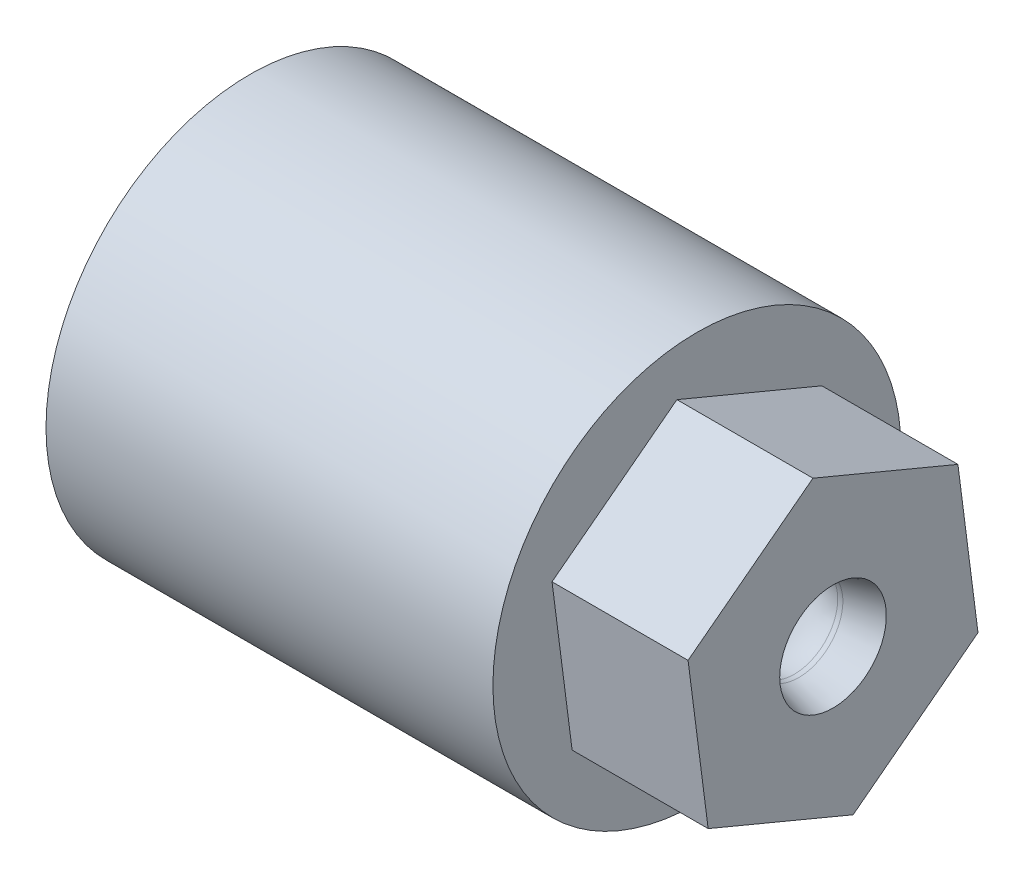
ISO-10303-21;
HEADER;
FILE_DESCRIPTION(('STEP AP214'),'2;1');
FILE_NAME('part.step','',(''),(''),'','','');
FILE_SCHEMA(('AUTOMOTIVE_DESIGN { 1 0 10303 214 1 1 1 1 }'));
ENDSEC;
DATA;
#1=APPLICATION_CONTEXT('core data for automotive mechanical design processes');
#2=APPLICATION_PROTOCOL_DEFINITION('international standard','automotive_design',2000,#1);
#3=PRODUCT_CONTEXT('',#1,'mechanical');
#4=PRODUCT('Part','Part','',(#3));
#5=PRODUCT_RELATED_PRODUCT_CATEGORY('part','',(#4));
#6=PRODUCT_DEFINITION_FORMATION('','',#4);
#7=PRODUCT_DEFINITION_CONTEXT('part definition',#1,'design');
#8=PRODUCT_DEFINITION('design','',#6,#7);
#9=PRODUCT_DEFINITION_SHAPE('','',#8);
#10=(LENGTH_UNIT() NAMED_UNIT(*) SI_UNIT(.MILLI.,.METRE.));
#11=(NAMED_UNIT(*) PLANE_ANGLE_UNIT() SI_UNIT($,.RADIAN.));
#12=(NAMED_UNIT(*) SI_UNIT($,.STERADIAN.) SOLID_ANGLE_UNIT());
#13=UNCERTAINTY_MEASURE_WITH_UNIT(LENGTH_MEASURE(1.E-05),#10,'distance_accuracy_value','');
#14=(GEOMETRIC_REPRESENTATION_CONTEXT(3) GLOBAL_UNCERTAINTY_ASSIGNED_CONTEXT((#13)) GLOBAL_UNIT_ASSIGNED_CONTEXT((#10,
#11,#12)) REPRESENTATION_CONTEXT('',''));
#15=CARTESIAN_POINT('',(0.,0.,0.));
#16=DIRECTION('',(0.,0.,1.));
#17=DIRECTION('',(1.,0.,0.));
#18=AXIS2_PLACEMENT_3D('',#15,#16,#17);
#19=CARTESIAN_POINT('',(1.81136600450768,9.525,0.));
#20=DIRECTION('',(-1.,0.,0.));
#21=DIRECTION('',(0.,0.,1.));
#22=AXIS2_PLACEMENT_3D('',#19,#20,#21);
#23=PLANE('',#22);
#24=CARTESIAN_POINT('',(1.81136600450768,0.,0.));
#25=DIRECTION('',(-1.,0.,0.));
#26=DIRECTION('',(0.,0.,1.));
#27=AXIS2_PLACEMENT_3D('',#24,#25,#26);
#28=CIRCLE('',#27,2.48868157866771);
#29=CARTESIAN_POINT('',(1.81136600450768,0.,2.48868157866771));
#30=VERTEX_POINT('',#29);
#31=EDGE_CURVE('E142',#30,#30,#28,.T.);
#32=ORIENTED_EDGE('',*,*,#31,.T.);
#33=EDGE_LOOP('',(#32));
#34=FACE_BOUND('',#33,.T.);
#35=DIRECTION('',(0.,-0.385175832029674,-0.922843203594331));
#36=VECTOR('',#35,1.);
#37=CARTESIAN_POINT('',(1.81136600450768,-5.860054342824,2.44586653338843));
#38=LINE('',#37,#36);
#39=CARTESIAN_POINT('',(1.81136600450768,-4.44793264137029,5.82917048568371));
#40=VERTEX_POINT('',#39);
#41=CARTESIAN_POINT('',(1.81136600450768,-7.27217604427771,-0.937437418906843));
#42=VERTEX_POINT('',#41);
#43=EDGE_CURVE('E49',#40,#42,#38,.T.);
#44=ORIENTED_EDGE('',*,*,#43,.T.);
#45=DIRECTION('',(0.,0.606617742007669,-0.794993657258671));
#46=VECTOR('',#45,1.);
#47=CARTESIAN_POINT('',(1.81136600450768,-5.04820972359256,-3.85202266174869));
#48=LINE('',#47,#46);
#49=CARTESIAN_POINT('',(1.81136600450768,-2.82424340290741,-6.76660790459055));
#50=VERTEX_POINT('',#49);
#51=EDGE_CURVE('E81',#42,#50,#48,.T.);
#52=ORIENTED_EDGE('',*,*,#51,.T.);
#53=DIRECTION('',(0.,0.991793574037343,0.12784954633566));
#54=VECTOR('',#53,1.);
#55=CARTESIAN_POINT('',(1.81136600450768,0.811844619231441,-6.29788919513713));
#56=LINE('',#55,#54);
#57=CARTESIAN_POINT('',(1.81136600450768,4.4479326413703,-5.8291704856837));
#58=VERTEX_POINT('',#57);
#59=EDGE_CURVE('E136',#50,#58,#56,.T.);
#60=ORIENTED_EDGE('',*,*,#59,.T.);
#61=DIRECTION('',(0.,0.385175832029674,0.922843203594331));
#62=VECTOR('',#61,1.);
#63=CARTESIAN_POINT('',(1.81136600450768,5.860054342824,-2.44586653338843));
#64=LINE('',#63,#62);
#65=CARTESIAN_POINT('',(1.81136600450768,7.27217604427771,0.937437418906843));
#66=VERTEX_POINT('',#65);
#67=EDGE_CURVE('E111',#58,#66,#64,.T.);
#68=ORIENTED_EDGE('',*,*,#67,.T.);
#69=DIRECTION('',(0.,-0.606617742007669,0.794993657258671));
#70=VECTOR('',#69,1.);
#71=CARTESIAN_POINT('',(1.81136600450768,5.04820972359256,3.85202266174869));
#72=LINE('',#71,#70);
#73=CARTESIAN_POINT('',(1.81136600450768,2.82424340290741,6.76660790459055));
#74=VERTEX_POINT('',#73);
#75=EDGE_CURVE('E132',#66,#74,#72,.T.);
#76=ORIENTED_EDGE('',*,*,#75,.T.);
#77=DIRECTION('',(0.,-0.991793574037343,-0.12784954633566));
#78=VECTOR('',#77,1.);
#79=CARTESIAN_POINT('',(1.81136600450768,-0.81184461923144,6.29788919513713));
#80=LINE('',#79,#78);
#81=EDGE_CURVE('E129',#74,#40,#80,.T.);
#82=ORIENTED_EDGE('',*,*,#81,.T.);
#83=EDGE_LOOP('',(#44,#52,#60,#68,#76,#82));
#84=FACE_BOUND('',#83,.T.);
#85=ADVANCED_FACE('F35',(#34,#84),#23,.F.);
#86=CARTESIAN_POINT('',(0.,0.,0.));
#87=DIRECTION('',(-1.,0.,0.));
#88=DIRECTION('',(0.,0.,1.));
#89=AXIS2_PLACEMENT_3D('',#86,#87,#88);
#90=CYLINDRICAL_SURFACE('',#89,9.525);
#91=CARTESIAN_POINT('',(-25.4,0.,0.));
#92=DIRECTION('',(-1.,0.,0.));
#93=DIRECTION('',(0.,0.,1.));
#94=AXIS2_PLACEMENT_3D('',#91,#92,#93);
#95=CIRCLE('',#94,9.525);
#96=CARTESIAN_POINT('',(-25.4,0.,9.525));
#97=VERTEX_POINT('',#96);
#98=EDGE_CURVE('E11',#97,#97,#95,.T.);
#99=ORIENTED_EDGE('',*,*,#98,.F.);
#100=EDGE_LOOP('',(#99));
#101=FACE_BOUND('',#100,.T.);
#102=CARTESIAN_POINT('',(-4.53863399549232,0.,0.));
#103=DIRECTION('',(1.,0.,0.));
#104=DIRECTION('',(0.,0.,-1.));
#105=AXIS2_PLACEMENT_3D('',#102,#103,#104);
#106=CIRCLE('',#105,9.525);
#107=CARTESIAN_POINT('',(-4.53863399549232,0.,-9.525));
#108=VERTEX_POINT('',#107);
#109=EDGE_CURVE('E124',#108,#108,#106,.T.);
#110=ORIENTED_EDGE('',*,*,#109,.F.);
#111=EDGE_LOOP('',(#110));
#112=FACE_BOUND('',#111,.T.);
#113=ADVANCED_FACE('F172',(#101,#112),#90,.T.);
#114=CARTESIAN_POINT('',(-25.4,5.74736391748426,0.));
#115=DIRECTION('',(1.,0.,0.));
#116=DIRECTION('',(0.,0.,-1.));
#117=AXIS2_PLACEMENT_3D('',#114,#115,#116);
#118=PLANE('',#117);
#119=CARTESIAN_POINT('',(-25.4,0.,0.));
#120=DIRECTION('',(-1.,0.,0.));
#121=DIRECTION('',(0.,0.,1.));
#122=AXIS2_PLACEMENT_3D('',#119,#120,#121);
#123=CIRCLE('',#122,5.74736391748426);
#124=CARTESIAN_POINT('',(-25.4,0.,5.74736391748426));
#125=VERTEX_POINT('',#124);
#126=EDGE_CURVE('E42',#125,#125,#123,.T.);
#127=ORIENTED_EDGE('',*,*,#126,.F.);
#128=EDGE_LOOP('',(#127));
#129=FACE_BOUND('',#128,.T.);
#130=ORIENTED_EDGE('',*,*,#98,.T.);
#131=EDGE_LOOP('',(#130));
#132=FACE_BOUND('',#131,.T.);
#133=ADVANCED_FACE('F169',(#129,#132),#118,.F.);
#134=CARTESIAN_POINT('',(0.,0.,0.));
#135=DIRECTION('',(-1.,0.,0.));
#136=DIRECTION('',(0.,0.,1.));
#137=AXIS2_PLACEMENT_3D('',#134,#135,#136);
#138=CYLINDRICAL_SURFACE('',#137,5.74736391748426);
#139=CARTESIAN_POINT('',(-6.29301491613203,0.,0.));
#140=DIRECTION('',(-1.,0.,0.));
#141=DIRECTION('',(0.,0.,1.));
#142=AXIS2_PLACEMENT_3D('',#139,#140,#141);
#143=CIRCLE('',#142,5.74736391748426);
#144=CARTESIAN_POINT('',(-6.29301491613203,0.,5.74736391748426));
#145=VERTEX_POINT('',#144);
#146=EDGE_CURVE('E162',#145,#145,#143,.T.);
#147=ORIENTED_EDGE('',*,*,#146,.F.);
#148=EDGE_LOOP('',(#147));
#149=FACE_BOUND('',#148,.T.);
#150=ORIENTED_EDGE('',*,*,#126,.T.);
#151=EDGE_LOOP('',(#150));
#152=FACE_BOUND('',#151,.T.);
#153=ADVANCED_FACE('F167',(#149,#152),#138,.F.);
#154=CARTESIAN_POINT('',(-6.29301491613202,0.,0.));
#155=DIRECTION('',(-1.,0.,0.));
#156=DIRECTION('',(0.,0.,1.));
#157=AXIS2_PLACEMENT_3D('',#154,#155,#156);
#158=DEGENERATE_TOROIDAL_SURFACE('',#157,2.57236391748426,3.175,.T.);
#159=CARTESIAN_POINT('',(-4.04795088586473,0.,0.));
#160=DIRECTION('',(-1.,0.,0.));
#161=DIRECTION('',(0.,0.,1.));
#162=AXIS2_PLACEMENT_3D('',#159,#160,#161);
#163=CIRCLE('',#162,4.81742794775155);
#164=CARTESIAN_POINT('',(-4.04795088586473,0.,4.81742794775155));
#165=VERTEX_POINT('',#164);
#166=EDGE_CURVE('E159',#165,#165,#163,.T.);
#167=ORIENTED_EDGE('',*,*,#166,.F.);
#168=EDGE_LOOP('',(#167));
#169=FACE_BOUND('',#168,.T.);
#170=ORIENTED_EDGE('',*,*,#146,.T.);
#171=EDGE_LOOP('',(#170));
#172=FACE_BOUND('',#171,.T.);
#173=ADVANCED_FACE('F227',(#169,#172),#158,.F.);
#174=CARTESIAN_POINT('',(-4.04795088586473,0.,0.));
#175=DIRECTION('',(-1.,0.,0.));
#176=DIRECTION('',(0.,0.,1.));
#177=AXIS2_PLACEMENT_3D('',#174,#175,#176);
#178=CONICAL_SURFACE('',#177,4.81742794775155,0.785398163397449);
#179=CARTESIAN_POINT('',(-2.1552614690566,0.,0.));
#180=DIRECTION('',(-1.,0.,0.));
#181=DIRECTION('',(0.,0.,1.));
#182=AXIS2_PLACEMENT_3D('',#179,#180,#181);
#183=CIRCLE('',#182,2.92473853094341);
#184=CARTESIAN_POINT('',(-2.1552614690566,0.,2.92473853094341));
#185=VERTEX_POINT('',#184);
#186=EDGE_CURVE('E156',#185,#185,#183,.T.);
#187=ORIENTED_EDGE('',*,*,#186,.F.);
#188=EDGE_LOOP('',(#187));
#189=FACE_BOUND('',#188,.T.);
#190=ORIENTED_EDGE('',*,*,#166,.T.);
#191=EDGE_LOOP('',(#190));
#192=FACE_BOUND('',#191,.T.);
#193=ADVANCED_FACE('F223',(#189,#192),#178,.F.);
#194=CARTESIAN_POINT('',(0.,0.,0.));
#195=DIRECTION('',(-1.,0.,0.));
#196=DIRECTION('',(0.,0.,1.));
#197=AXIS2_PLACEMENT_3D('',#194,#195,#196);
#198=TOROIDAL_SURFACE('',#197,5.08,3.048);
#199=CARTESIAN_POINT('',(0.,0.,0.));
#200=DIRECTION('',(-1.,0.,0.));
#201=DIRECTION('',(0.,0.,1.));
#202=AXIS2_PLACEMENT_3D('',#199,#200,#201);
#203=CIRCLE('',#202,2.032);
#204=CARTESIAN_POINT('',(0.,0.,2.032));
#205=VERTEX_POINT('',#204);
#206=EDGE_CURVE('E153',#205,#205,#203,.T.);
#207=ORIENTED_EDGE('',*,*,#206,.F.);
#208=EDGE_LOOP('',(#207));
#209=FACE_BOUND('',#208,.T.);
#210=ORIENTED_EDGE('',*,*,#186,.T.);
#211=EDGE_LOOP('',(#210));
#212=FACE_BOUND('',#211,.T.);
#213=ADVANCED_FACE('F219',(#209,#212),#198,.T.);
#214=CARTESIAN_POINT('',(0.,0.,0.));
#215=DIRECTION('',(-1.,0.,0.));
#216=DIRECTION('',(0.,0.,1.));
#217=AXIS2_PLACEMENT_3D('',#214,#215,#216);
#218=TOROIDAL_SURFACE('',#217,2.8448,0.8128);
#219=CARTESIAN_POINT('',(0.21036811985933,0.,0.));
#220=DIRECTION('',(-1.,0.,0.));
#221=DIRECTION('',(0.,0.,1.));
#222=AXIS2_PLACEMENT_3D('',#219,#220,#221);
#223=CIRCLE('',#222,2.05969548839225);
#224=CARTESIAN_POINT('',(0.21036811985933,0.,2.05969548839225));
#225=VERTEX_POINT('',#224);
#226=EDGE_CURVE('E150',#225,#225,#223,.T.);
#227=ORIENTED_EDGE('',*,*,#226,.F.);
#228=EDGE_LOOP('',(#227));
#229=FACE_BOUND('',#228,.T.);
#230=ORIENTED_EDGE('',*,*,#206,.T.);
#231=EDGE_LOOP('',(#230));
#232=FACE_BOUND('',#231,.T.);
#233=ADVANCED_FACE('F215',(#229,#232),#218,.T.);
#234=CARTESIAN_POINT('',(0.21036811985933,0.,0.));
#235=DIRECTION('',(1.,0.,0.));
#236=DIRECTION('',(0.,0.,-1.));
#237=AXIS2_PLACEMENT_3D('',#234,#235,#236);
#238=CONICAL_SURFACE('',#237,2.05969548839225,0.261799387799151);
#239=ORIENTED_EDGE('',*,*,#31,.F.);
#240=EDGE_LOOP('',(#239));
#241=FACE_BOUND('',#240,.T.);
#242=ORIENTED_EDGE('',*,*,#226,.T.);
#243=EDGE_LOOP('',(#242));
#244=FACE_BOUND('',#243,.T.);
#245=ADVANCED_FACE('F205',(#241,#244),#238,.F.);
#246=CARTESIAN_POINT('',(-4.53863399549232,-5.860054342824,2.44586653338843));
#247=DIRECTION('',(0.,-0.922843203594331,0.385175832029674));
#248=DIRECTION('',(0.,-0.385175832029674,-0.922843203594331));
#249=AXIS2_PLACEMENT_3D('',#246,#247,#248);
#250=PLANE('',#249);
#251=ORIENTED_EDGE('',*,*,#43,.F.);
#252=DIRECTION('',(1.,0.,0.));
#253=VECTOR('',#252,1.);
#254=CARTESIAN_POINT('',(-4.53863399549232,-4.44793264137029,5.82917048568371));
#255=LINE('',#254,#253);
#256=CARTESIAN_POINT('',(-4.53863399549232,-4.44793264137029,5.82917048568371));
#257=VERTEX_POINT('',#256);
#258=EDGE_CURVE('E127',#257,#40,#255,.T.);
#259=ORIENTED_EDGE('',*,*,#258,.F.);
#260=DIRECTION('',(0.,-0.385175832029674,-0.922843203594331));
#261=VECTOR('',#260,1.);
#262=CARTESIAN_POINT('',(-4.53863399549232,-5.860054342824,2.44586653338843));
#263=LINE('',#262,#261);
#264=CARTESIAN_POINT('',(-4.53863399549232,-7.27217604427771,-0.937437418906843));
#265=VERTEX_POINT('',#264);
#266=EDGE_CURVE('E139',#257,#265,#263,.T.);
#267=ORIENTED_EDGE('',*,*,#266,.T.);
#268=DIRECTION('',(1.,0.,0.));
#269=VECTOR('',#268,1.);
#270=CARTESIAN_POINT('',(-4.53863399549232,-7.27217604427771,-0.937437418906843));
#271=LINE('',#270,#269);
#272=EDGE_CURVE('E140',#265,#42,#271,.T.);
#273=ORIENTED_EDGE('',*,*,#272,.T.);
#274=EDGE_LOOP('',(#251,#259,#267,#273));
#275=FACE_BOUND('',#274,.T.);
#276=ADVANCED_FACE('F196',(#275),#250,.T.);
#277=CARTESIAN_POINT('',(-4.53863399549232,-5.04820972359256,-3.85202266174869));
#278=DIRECTION('',(0.,-0.794993657258671,-0.606617742007669));
#279=DIRECTION('',(0.,0.606617742007669,-0.794993657258671));
#280=AXIS2_PLACEMENT_3D('',#277,#278,#279);
#281=PLANE('',#280);
#282=ORIENTED_EDGE('',*,*,#51,.F.);
#283=ORIENTED_EDGE('',*,*,#272,.F.);
#284=DIRECTION('',(0.,0.606617742007669,-0.794993657258671));
#285=VECTOR('',#284,1.);
#286=CARTESIAN_POINT('',(-4.53863399549232,-5.04820972359256,-3.85202266174869));
#287=LINE('',#286,#285);
#288=CARTESIAN_POINT('',(-4.53863399549232,-2.82424340290741,-6.76660790459055));
#289=VERTEX_POINT('',#288);
#290=EDGE_CURVE('E58',#265,#289,#287,.T.);
#291=ORIENTED_EDGE('',*,*,#290,.T.);
#292=DIRECTION('',(1.,0.,0.));
#293=VECTOR('',#292,1.);
#294=CARTESIAN_POINT('',(-4.53863399549232,-2.82424340290741,-6.76660790459055));
#295=LINE('',#294,#293);
#296=EDGE_CURVE('E103',#289,#50,#295,.T.);
#297=ORIENTED_EDGE('',*,*,#296,.T.);
#298=EDGE_LOOP('',(#282,#283,#291,#297));
#299=FACE_BOUND('',#298,.T.);
#300=ADVANCED_FACE('F198',(#299),#281,.T.);
#301=CARTESIAN_POINT('',(-4.53863399549232,0.811844619231441,-6.29788919513713));
#302=DIRECTION('',(0.,0.12784954633566,-0.991793574037343));
#303=DIRECTION('',(0.,0.991793574037343,0.12784954633566));
#304=AXIS2_PLACEMENT_3D('',#301,#302,#303);
#305=PLANE('',#304);
#306=ORIENTED_EDGE('',*,*,#59,.F.);
#307=ORIENTED_EDGE('',*,*,#296,.F.);
#308=DIRECTION('',(0.,0.991793574037343,0.12784954633566));
#309=VECTOR('',#308,1.);
#310=CARTESIAN_POINT('',(-4.53863399549232,0.811844619231441,-6.29788919513713));
#311=LINE('',#310,#309);
#312=CARTESIAN_POINT('',(-4.53863399549232,4.4479326413703,-5.8291704856837));
#313=VERTEX_POINT('',#312);
#314=EDGE_CURVE('E97',#289,#313,#311,.T.);
#315=ORIENTED_EDGE('',*,*,#314,.T.);
#316=DIRECTION('',(1.,0.,0.));
#317=VECTOR('',#316,1.);
#318=CARTESIAN_POINT('',(-4.53863399549232,4.4479326413703,-5.8291704856837));
#319=LINE('',#318,#317);
#320=EDGE_CURVE('E101',#313,#58,#319,.T.);
#321=ORIENTED_EDGE('',*,*,#320,.T.);
#322=EDGE_LOOP('',(#306,#307,#315,#321));
#323=FACE_BOUND('',#322,.T.);
#324=ADVANCED_FACE('F100',(#323),#305,.T.);
#325=CARTESIAN_POINT('',(-4.53863399549232,5.860054342824,-2.44586653338843));
#326=DIRECTION('',(0.,0.922843203594331,-0.385175832029674));
#327=DIRECTION('',(0.,0.385175832029674,0.922843203594331));
#328=AXIS2_PLACEMENT_3D('',#325,#326,#327);
#329=PLANE('',#328);
#330=ORIENTED_EDGE('',*,*,#67,.F.);
#331=ORIENTED_EDGE('',*,*,#320,.F.);
#332=DIRECTION('',(0.,0.385175832029674,0.922843203594331));
#333=VECTOR('',#332,1.);
#334=CARTESIAN_POINT('',(-4.53863399549232,5.860054342824,-2.44586653338843));
#335=LINE('',#334,#333);
#336=CARTESIAN_POINT('',(-4.53863399549232,7.27217604427771,0.937437418906843));
#337=VERTEX_POINT('',#336);
#338=EDGE_CURVE('E105',#313,#337,#335,.T.);
#339=ORIENTED_EDGE('',*,*,#338,.T.);
#340=DIRECTION('',(1.,0.,0.));
#341=VECTOR('',#340,1.);
#342=CARTESIAN_POINT('',(-4.53863399549232,7.27217604427771,0.937437418906843));
#343=LINE('',#342,#341);
#344=EDGE_CURVE('E113',#337,#66,#343,.T.);
#345=ORIENTED_EDGE('',*,*,#344,.T.);
#346=EDGE_LOOP('',(#330,#331,#339,#345));
#347=FACE_BOUND('',#346,.T.);
#348=ADVANCED_FACE('F108',(#347),#329,.T.);
#349=CARTESIAN_POINT('',(-4.53863399549232,5.04820972359256,3.85202266174869));
#350=DIRECTION('',(0.,0.794993657258671,0.606617742007669));
#351=DIRECTION('',(0.,-0.606617742007669,0.794993657258671));
#352=AXIS2_PLACEMENT_3D('',#349,#350,#351);
#353=PLANE('',#352);
#354=ORIENTED_EDGE('',*,*,#75,.F.);
#355=ORIENTED_EDGE('',*,*,#344,.F.);
#356=DIRECTION('',(0.,-0.606617742007669,0.794993657258671));
#357=VECTOR('',#356,1.);
#358=CARTESIAN_POINT('',(-4.53863399549232,5.04820972359256,3.85202266174869));
#359=LINE('',#358,#357);
#360=CARTESIAN_POINT('',(-4.53863399549232,2.82424340290741,6.76660790459055));
#361=VERTEX_POINT('',#360);
#362=EDGE_CURVE('E118',#337,#361,#359,.T.);
#363=ORIENTED_EDGE('',*,*,#362,.T.);
#364=DIRECTION('',(1.,0.,0.));
#365=VECTOR('',#364,1.);
#366=CARTESIAN_POINT('',(-4.53863399549232,2.82424340290741,6.76660790459055));
#367=LINE('',#366,#365);
#368=EDGE_CURVE('E145',#361,#74,#367,.T.);
#369=ORIENTED_EDGE('',*,*,#368,.T.);
#370=EDGE_LOOP('',(#354,#355,#363,#369));
#371=FACE_BOUND('',#370,.T.);
#372=ADVANCED_FACE('F185',(#371),#353,.T.);
#373=CARTESIAN_POINT('',(-4.53863399549232,-0.81184461923144,6.29788919513713));
#374=DIRECTION('',(0.,-0.12784954633566,0.991793574037343));
#375=DIRECTION('',(0.,-0.991793574037343,-0.12784954633566));
#376=AXIS2_PLACEMENT_3D('',#373,#374,#375);
#377=PLANE('',#376);
#378=ORIENTED_EDGE('',*,*,#81,.F.);
#379=ORIENTED_EDGE('',*,*,#368,.F.);
#380=DIRECTION('',(0.,-0.991793574037343,-0.12784954633566));
#381=VECTOR('',#380,1.);
#382=CARTESIAN_POINT('',(-4.53863399549232,-0.81184461923144,6.29788919513713));
#383=LINE('',#382,#381);
#384=EDGE_CURVE('E88',#361,#257,#383,.T.);
#385=ORIENTED_EDGE('',*,*,#384,.T.);
#386=ORIENTED_EDGE('',*,*,#258,.T.);
#387=EDGE_LOOP('',(#378,#379,#385,#386));
#388=FACE_BOUND('',#387,.T.);
#389=ADVANCED_FACE('F180',(#388),#377,.T.);
#390=CARTESIAN_POINT('',(-4.53863399549232,0.,0.));
#391=DIRECTION('',(1.,0.,0.));
#392=DIRECTION('',(0.,0.,-1.));
#393=AXIS2_PLACEMENT_3D('',#390,#391,#392);
#394=PLANE('',#393);
#395=ORIENTED_EDGE('',*,*,#266,.F.);
#396=ORIENTED_EDGE('',*,*,#384,.F.);
#397=ORIENTED_EDGE('',*,*,#362,.F.);
#398=ORIENTED_EDGE('',*,*,#338,.F.);
#399=ORIENTED_EDGE('',*,*,#314,.F.);
#400=ORIENTED_EDGE('',*,*,#290,.F.);
#401=EDGE_LOOP('',(#395,#396,#397,#398,#399,#400));
#402=FACE_BOUND('',#401,.T.);
#403=ORIENTED_EDGE('',*,*,#109,.T.);
#404=EDGE_LOOP('',(#403));
#405=FACE_BOUND('',#404,.T.);
#406=ADVANCED_FACE('F116',(#402,#405),#394,.T.);
#407=CLOSED_SHELL('',(#85,#113,#133,#153,#173,#193,#213,#233,#245,#276,#300,#324,#348,#372,#389,#406));
#408=MANIFOLD_SOLID_BREP('B2',#407);
#409=ADVANCED_BREP_SHAPE_REPRESENTATION('',(#18,#408),#14);
#410=SHAPE_DEFINITION_REPRESENTATION(#9,#409);
ENDSEC;
END-ISO-10303-21;
